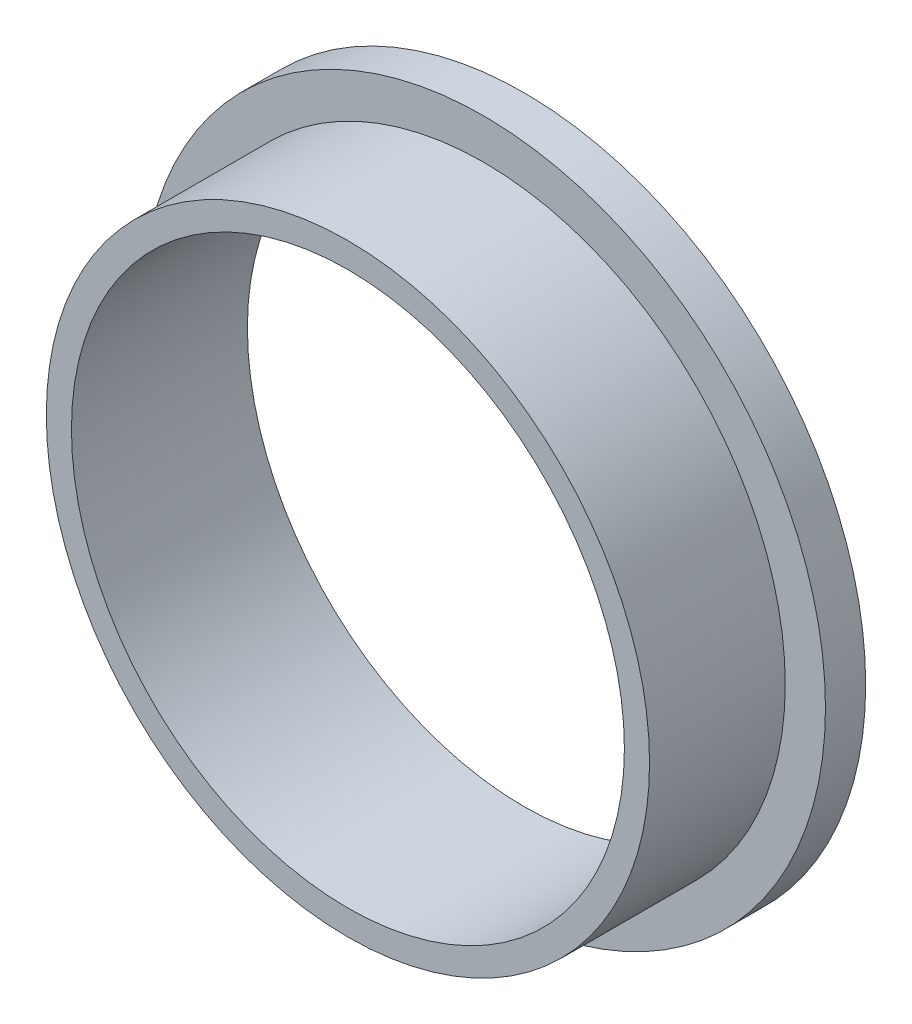
ISO-10303-21;
HEADER;
FILE_DESCRIPTION(('STEP AP214'),'2;1');
FILE_NAME('part.step','',(''),(''),'','','');
FILE_SCHEMA(('AUTOMOTIVE_DESIGN { 1 0 10303 214 1 1 1 1 }'));
ENDSEC;
DATA;
#1=APPLICATION_CONTEXT('core data for automotive mechanical design processes');
#2=APPLICATION_PROTOCOL_DEFINITION('international standard','automotive_design',2000,#1);
#3=PRODUCT_CONTEXT('',#1,'mechanical');
#4=PRODUCT('Part','Part','',(#3));
#5=PRODUCT_RELATED_PRODUCT_CATEGORY('part','',(#4));
#6=PRODUCT_DEFINITION_FORMATION('','',#4);
#7=PRODUCT_DEFINITION_CONTEXT('part definition',#1,'design');
#8=PRODUCT_DEFINITION('design','',#6,#7);
#9=PRODUCT_DEFINITION_SHAPE('','',#8);
#10=(LENGTH_UNIT() NAMED_UNIT(*) SI_UNIT(.MILLI.,.METRE.));
#11=(NAMED_UNIT(*) PLANE_ANGLE_UNIT() SI_UNIT($,.RADIAN.));
#12=(NAMED_UNIT(*) SI_UNIT($,.STERADIAN.) SOLID_ANGLE_UNIT());
#13=UNCERTAINTY_MEASURE_WITH_UNIT(LENGTH_MEASURE(1.E-05),#10,'distance_accuracy_value','');
#14=(GEOMETRIC_REPRESENTATION_CONTEXT(3) GLOBAL_UNCERTAINTY_ASSIGNED_CONTEXT((#13)) GLOBAL_UNIT_ASSIGNED_CONTEXT((#10,
#11,#12)) REPRESENTATION_CONTEXT('',''));
#15=CARTESIAN_POINT('',(0.,0.,0.));
#16=DIRECTION('',(0.,0.,1.));
#17=DIRECTION('',(1.,0.,0.));
#18=AXIS2_PLACEMENT_3D('',#15,#16,#17);
#19=CARTESIAN_POINT('',(0.,0.,3.5));
#20=DIRECTION('',(0.,0.,1.));
#21=DIRECTION('',(1.,0.,0.));
#22=AXIS2_PLACEMENT_3D('',#19,#20,#21);
#23=PLANE('',#22);
#24=CARTESIAN_POINT('',(0.,0.,3.5));
#25=DIRECTION('',(0.,0.,1.));
#26=DIRECTION('',(1.,0.,0.));
#27=AXIS2_PLACEMENT_3D('',#24,#25,#26);
#28=CIRCLE('',#27,6.);
#29=CARTESIAN_POINT('',(6.,0.,3.5));
#30=VERTEX_POINT('',#29);
#31=EDGE_CURVE('E10',#30,#30,#28,.T.);
#32=ORIENTED_EDGE('',*,*,#31,.T.);
#33=EDGE_LOOP('',(#32));
#34=FACE_BOUND('',#33,.T.);
#35=CARTESIAN_POINT('',(0.,0.,3.5));
#36=DIRECTION('',(0.,0.,1.));
#37=DIRECTION('',(1.,0.,0.));
#38=AXIS2_PLACEMENT_3D('',#35,#36,#37);
#39=CIRCLE('',#38,5.5);
#40=CARTESIAN_POINT('',(5.5,0.,3.5));
#41=VERTEX_POINT('',#40);
#42=EDGE_CURVE('E39',#41,#41,#39,.T.);
#43=ORIENTED_EDGE('',*,*,#42,.F.);
#44=EDGE_LOOP('',(#43));
#45=FACE_BOUND('',#44,.T.);
#46=ADVANCED_FACE('F32',(#34,#45),#23,.T.);
#47=CARTESIAN_POINT('',(0.,0.,0.));
#48=DIRECTION('',(0.,0.,1.));
#49=DIRECTION('',(1.,0.,0.));
#50=AXIS2_PLACEMENT_3D('',#47,#48,#49);
#51=PLANE('',#50);
#52=CARTESIAN_POINT('',(0.,0.,0.));
#53=DIRECTION('',(0.,0.,1.));
#54=DIRECTION('',(1.,0.,0.));
#55=AXIS2_PLACEMENT_3D('',#52,#53,#54);
#56=CIRCLE('',#55,5.5);
#57=CARTESIAN_POINT('',(5.5,0.,0.));
#58=VERTEX_POINT('',#57);
#59=EDGE_CURVE('E43',#58,#58,#56,.T.);
#60=ORIENTED_EDGE('',*,*,#59,.T.);
#61=EDGE_LOOP('',(#60));
#62=FACE_BOUND('',#61,.T.);
#63=CARTESIAN_POINT('',(0.,0.,0.));
#64=DIRECTION('',(0.,0.,1.));
#65=DIRECTION('',(1.,0.,0.));
#66=AXIS2_PLACEMENT_3D('',#63,#64,#65);
#67=CIRCLE('',#66,6.8);
#68=CARTESIAN_POINT('',(6.8,0.,0.));
#69=VERTEX_POINT('',#68);
#70=EDGE_CURVE('E53',#69,#69,#67,.T.);
#71=ORIENTED_EDGE('',*,*,#70,.F.);
#72=EDGE_LOOP('',(#71));
#73=FACE_BOUND('',#72,.T.);
#74=ADVANCED_FACE('F68',(#62,#73),#51,.F.);
#75=CARTESIAN_POINT('',(0.,0.,3.5));
#76=DIRECTION('',(0.,0.,-1.));
#77=DIRECTION('',(-1.,0.,0.));
#78=AXIS2_PLACEMENT_3D('',#75,#76,#77);
#79=CYLINDRICAL_SURFACE('',#78,6.);
#80=CARTESIAN_POINT('',(0.,0.,0.8));
#81=DIRECTION('',(0.,0.,1.));
#82=DIRECTION('',(1.,0.,0.));
#83=AXIS2_PLACEMENT_3D('',#80,#81,#82);
#84=CIRCLE('',#83,6.);
#85=CARTESIAN_POINT('',(6.,0.,0.8));
#86=VERTEX_POINT('',#85);
#87=EDGE_CURVE('E48',#86,#86,#84,.T.);
#88=ORIENTED_EDGE('',*,*,#87,.T.);
#89=EDGE_LOOP('',(#88));
#90=FACE_BOUND('',#89,.T.);
#91=ORIENTED_EDGE('',*,*,#31,.F.);
#92=EDGE_LOOP('',(#91));
#93=FACE_BOUND('',#92,.T.);
#94=ADVANCED_FACE('F34',(#90,#93),#79,.T.);
#95=CARTESIAN_POINT('',(0.,0.,3.5));
#96=DIRECTION('',(0.,0.,-1.));
#97=DIRECTION('',(-1.,0.,0.));
#98=AXIS2_PLACEMENT_3D('',#95,#96,#97);
#99=CYLINDRICAL_SURFACE('',#98,5.5);
#100=ORIENTED_EDGE('',*,*,#42,.T.);
#101=EDGE_LOOP('',(#100));
#102=FACE_BOUND('',#101,.T.);
#103=ORIENTED_EDGE('',*,*,#59,.F.);
#104=EDGE_LOOP('',(#103));
#105=FACE_BOUND('',#104,.T.);
#106=ADVANCED_FACE('F75',(#102,#105),#99,.F.);
#107=CARTESIAN_POINT('',(0.,0.,0.8));
#108=DIRECTION('',(0.,0.,1.));
#109=DIRECTION('',(1.,0.,0.));
#110=AXIS2_PLACEMENT_3D('',#107,#108,#109);
#111=PLANE('',#110);
#112=CARTESIAN_POINT('',(0.,0.,0.8));
#113=DIRECTION('',(0.,0.,1.));
#114=DIRECTION('',(1.,0.,0.));
#115=AXIS2_PLACEMENT_3D('',#112,#113,#114);
#116=CIRCLE('',#115,6.8);
#117=CARTESIAN_POINT('',(6.8,0.,0.8));
#118=VERTEX_POINT('',#117);
#119=EDGE_CURVE('E52',#118,#118,#116,.T.);
#120=ORIENTED_EDGE('',*,*,#119,.T.);
#121=EDGE_LOOP('',(#120));
#122=FACE_BOUND('',#121,.T.);
#123=ORIENTED_EDGE('',*,*,#87,.F.);
#124=EDGE_LOOP('',(#123));
#125=FACE_BOUND('',#124,.T.);
#126=ADVANCED_FACE('F59',(#122,#125),#111,.T.);
#127=CARTESIAN_POINT('',(0.,0.,0.8));
#128=DIRECTION('',(0.,0.,-1.));
#129=DIRECTION('',(-1.,0.,0.));
#130=AXIS2_PLACEMENT_3D('',#127,#128,#129);
#131=CYLINDRICAL_SURFACE('',#130,6.8);
#132=ORIENTED_EDGE('',*,*,#119,.F.);
#133=EDGE_LOOP('',(#132));
#134=FACE_BOUND('',#133,.T.);
#135=ORIENTED_EDGE('',*,*,#70,.T.);
#136=EDGE_LOOP('',(#135));
#137=FACE_BOUND('',#136,.T.);
#138=ADVANCED_FACE('F62',(#134,#137),#131,.T.);
#139=CLOSED_SHELL('',(#46,#74,#94,#106,#126,#138));
#140=MANIFOLD_SOLID_BREP('B2',#139);
#141=ADVANCED_BREP_SHAPE_REPRESENTATION('',(#18,#140),#14);
#142=SHAPE_DEFINITION_REPRESENTATION(#9,#141);
ENDSEC;
END-ISO-10303-21;
